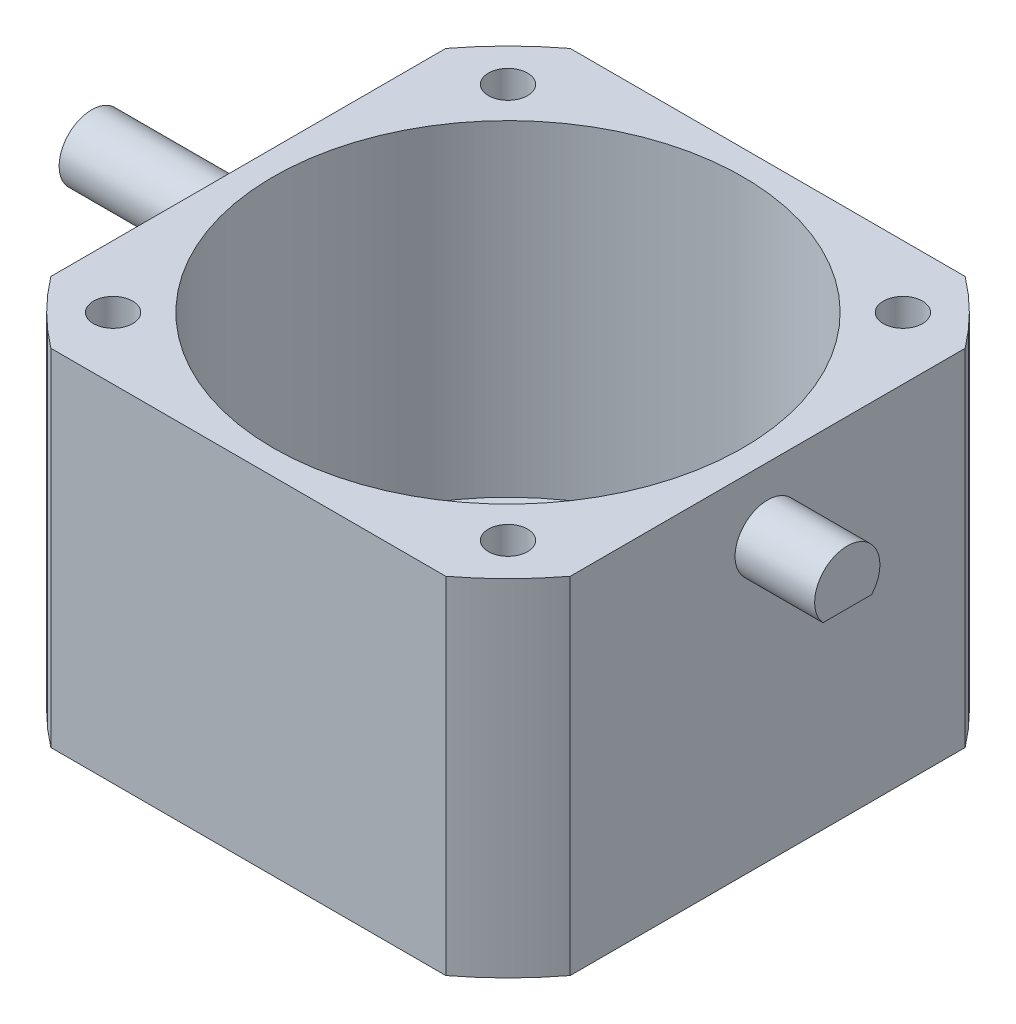
ISO-10303-21;
HEADER;
FILE_DESCRIPTION(('STEP AP214'),'2;1');
FILE_NAME('part.step','',(''),(''),'','','');
FILE_SCHEMA(('AUTOMOTIVE_DESIGN { 1 0 10303 214 1 1 1 1 }'));
ENDSEC;
DATA;
#1=APPLICATION_CONTEXT('core data for automotive mechanical design processes');
#2=APPLICATION_PROTOCOL_DEFINITION('international standard','automotive_design',2000,#1);
#3=PRODUCT_CONTEXT('',#1,'mechanical');
#4=PRODUCT('Part','Part','',(#3));
#5=PRODUCT_RELATED_PRODUCT_CATEGORY('part','',(#4));
#6=PRODUCT_DEFINITION_FORMATION('','',#4);
#7=PRODUCT_DEFINITION_CONTEXT('part definition',#1,'design');
#8=PRODUCT_DEFINITION('design','',#6,#7);
#9=PRODUCT_DEFINITION_SHAPE('','',#8);
#10=(LENGTH_UNIT() NAMED_UNIT(*) SI_UNIT(.MILLI.,.METRE.));
#11=(NAMED_UNIT(*) PLANE_ANGLE_UNIT() SI_UNIT($,.RADIAN.));
#12=(NAMED_UNIT(*) SI_UNIT($,.STERADIAN.) SOLID_ANGLE_UNIT());
#13=UNCERTAINTY_MEASURE_WITH_UNIT(LENGTH_MEASURE(1.E-05),#10,'distance_accuracy_value','');
#14=(GEOMETRIC_REPRESENTATION_CONTEXT(3) GLOBAL_UNCERTAINTY_ASSIGNED_CONTEXT((#13)) GLOBAL_UNIT_ASSIGNED_CONTEXT((#10,
#11,#12)) REPRESENTATION_CONTEXT('',''));
#15=CARTESIAN_POINT('',(0.,0.,0.));
#16=DIRECTION('',(0.,0.,1.));
#17=DIRECTION('',(1.,0.,0.));
#18=AXIS2_PLACEMENT_3D('',#15,#16,#17);
#19=CARTESIAN_POINT('',(0.,40.,0.));
#20=DIRECTION('',(0.,0.,-1.));
#21=DIRECTION('',(-1.,0.,0.));
#22=AXIS2_PLACEMENT_3D('',#19,#20,#21);
#23=PLANE('',#22);
#24=DIRECTION('',(-1.,0.,0.));
#25=VECTOR('',#24,1.);
#26=CARTESIAN_POINT('',(0.,13.5,0.));
#27=LINE('',#26,#25);
#28=CARTESIAN_POINT('',(35.0324155375142,13.5,0.));
#29=VERTEX_POINT('',#28);
#30=CARTESIAN_POINT('',(4.76758446248583,13.5,0.));
#31=VERTEX_POINT('',#30);
#32=EDGE_CURVE('E278',#29,#31,#27,.T.);
#33=ORIENTED_EDGE('',*,*,#32,.F.);
#34=DIRECTION('',(0.,1.,0.));
#35=VECTOR('',#34,1.);
#36=CARTESIAN_POINT('',(35.0324155375142,0.,0.));
#37=LINE('',#36,#35);
#38=CARTESIAN_POINT('',(35.0324155375142,40.,0.));
#39=VERTEX_POINT('',#38);
#40=EDGE_CURVE('E211',#29,#39,#37,.T.);
#41=ORIENTED_EDGE('',*,*,#40,.T.);
#42=DIRECTION('',(1.,0.,0.));
#43=VECTOR('',#42,1.);
#44=CARTESIAN_POINT('',(0.,40.,0.));
#45=LINE('',#44,#43);
#46=CARTESIAN_POINT('',(4.76758446248583,40.,0.));
#47=VERTEX_POINT('',#46);
#48=EDGE_CURVE('E234',#47,#39,#45,.T.);
#49=ORIENTED_EDGE('',*,*,#48,.F.);
#50=DIRECTION('',(0.,1.,0.));
#51=VECTOR('',#50,1.);
#52=CARTESIAN_POINT('',(4.76758446248583,0.,0.));
#53=LINE('',#52,#51);
#54=EDGE_CURVE('E198',#31,#47,#53,.T.);
#55=ORIENTED_EDGE('',*,*,#54,.F.);
#56=EDGE_LOOP('',(#33,#41,#49,#55));
#57=FACE_BOUND('',#56,.T.);
#58=ADVANCED_FACE('F96',(#57),#23,.F.);
#59=CARTESIAN_POINT('',(0.,40.,-39.8));
#60=DIRECTION('',(0.,0.,1.));
#61=DIRECTION('',(1.,0.,0.));
#62=AXIS2_PLACEMENT_3D('',#59,#60,#61);
#63=PLANE('',#62);
#64=DIRECTION('',(1.,0.,0.));
#65=VECTOR('',#64,1.);
#66=CARTESIAN_POINT('',(0.,13.5,-39.8));
#67=LINE('',#66,#65);
#68=CARTESIAN_POINT('',(4.76758446248581,13.5,-39.8));
#69=VERTEX_POINT('',#68);
#70=CARTESIAN_POINT('',(35.0324155375142,13.5,-39.8));
#71=VERTEX_POINT('',#70);
#72=EDGE_CURVE('E174',#69,#71,#67,.T.);
#73=ORIENTED_EDGE('',*,*,#72,.F.);
#74=DIRECTION('',(0.,1.,0.));
#75=VECTOR('',#74,1.);
#76=CARTESIAN_POINT('',(4.76758446248582,0.,-39.8));
#77=LINE('',#76,#75);
#78=CARTESIAN_POINT('',(4.76758446248582,40.,-39.8));
#79=VERTEX_POINT('',#78);
#80=EDGE_CURVE('E185',#69,#79,#77,.T.);
#81=ORIENTED_EDGE('',*,*,#80,.T.);
#82=DIRECTION('',(-1.,0.,0.));
#83=VECTOR('',#82,1.);
#84=CARTESIAN_POINT('',(0.,40.,-39.8));
#85=LINE('',#84,#83);
#86=CARTESIAN_POINT('',(35.0324155375142,40.,-39.8));
#87=VERTEX_POINT('',#86);
#88=EDGE_CURVE('E240',#87,#79,#85,.T.);
#89=ORIENTED_EDGE('',*,*,#88,.F.);
#90=DIRECTION('',(0.,1.,0.));
#91=VECTOR('',#90,1.);
#92=CARTESIAN_POINT('',(35.0324155375142,0.,-39.8));
#93=LINE('',#92,#91);
#94=EDGE_CURVE('E187',#71,#87,#93,.T.);
#95=ORIENTED_EDGE('',*,*,#94,.F.);
#96=EDGE_LOOP('',(#73,#81,#89,#95));
#97=FACE_BOUND('',#96,.T.);
#98=ADVANCED_FACE('F183',(#97),#63,.F.);
#99=CARTESIAN_POINT('',(39.8,40.,0.));
#100=DIRECTION('',(-1.,0.,0.));
#101=DIRECTION('',(0.,0.,1.));
#102=AXIS2_PLACEMENT_3D('',#99,#100,#101);
#103=PLANE('',#102);
#104=CARTESIAN_POINT('',(39.8,35.,-19.9));
#105=DIRECTION('',(-1.,0.,0.));
#106=DIRECTION('',(0.,0.,1.));
#107=AXIS2_PLACEMENT_3D('',#104,#105,#106);
#108=CIRCLE('',#107,2.5);
#109=CARTESIAN_POINT('',(39.8,35.,-17.4));
#110=VERTEX_POINT('',#109);
#111=EDGE_CURVE('E13',#110,#110,#108,.F.);
#112=ORIENTED_EDGE('',*,*,#111,.F.);
#113=EDGE_LOOP('',(#112));
#114=FACE_BOUND('',#113,.T.);
#115=DIRECTION('',(0.,0.,1.));
#116=VECTOR('',#115,1.);
#117=CARTESIAN_POINT('',(39.8,13.5,0.));
#118=LINE('',#117,#116);
#119=CARTESIAN_POINT('',(39.8,13.5,-35.0324155375142));
#120=VERTEX_POINT('',#119);
#121=CARTESIAN_POINT('',(39.8,13.5,-4.76758446248582));
#122=VERTEX_POINT('',#121);
#123=EDGE_CURVE('E272',#120,#122,#118,.T.);
#124=ORIENTED_EDGE('',*,*,#123,.F.);
#125=DIRECTION('',(0.,1.,0.));
#126=VECTOR('',#125,1.);
#127=CARTESIAN_POINT('',(39.8,0.,-35.0324155375142));
#128=LINE('',#127,#126);
#129=CARTESIAN_POINT('',(39.8,40.,-35.0324155375142));
#130=VERTEX_POINT('',#129);
#131=EDGE_CURVE('E217',#120,#130,#128,.T.);
#132=ORIENTED_EDGE('',*,*,#131,.T.);
#133=DIRECTION('',(0.,0.,-1.));
#134=VECTOR('',#133,1.);
#135=CARTESIAN_POINT('',(39.8,40.,0.));
#136=LINE('',#135,#134);
#137=CARTESIAN_POINT('',(39.8,40.,-4.76758446248582));
#138=VERTEX_POINT('',#137);
#139=EDGE_CURVE('E237',#138,#130,#136,.T.);
#140=ORIENTED_EDGE('',*,*,#139,.F.);
#141=DIRECTION('',(0.,1.,0.));
#142=VECTOR('',#141,1.);
#143=CARTESIAN_POINT('',(39.8,0.,-4.76758446248582));
#144=LINE('',#143,#142);
#145=EDGE_CURVE('E205',#122,#138,#144,.T.);
#146=ORIENTED_EDGE('',*,*,#145,.F.);
#147=EDGE_LOOP('',(#124,#132,#140,#146));
#148=FACE_BOUND('',#147,.T.);
#149=ADVANCED_FACE('F253',(#114,#148),#103,.F.);
#150=CARTESIAN_POINT('',(0.,40.,0.));
#151=DIRECTION('',(1.,0.,0.));
#152=DIRECTION('',(0.,0.,-1.));
#153=AXIS2_PLACEMENT_3D('',#150,#151,#152);
#154=PLANE('',#153);
#155=CARTESIAN_POINT('',(0.,35.,-19.9));
#156=DIRECTION('',(1.,0.,0.));
#157=DIRECTION('',(0.,0.,-1.));
#158=AXIS2_PLACEMENT_3D('',#155,#156,#157);
#159=CIRCLE('',#158,2.5);
#160=CARTESIAN_POINT('',(0.,35.,-22.4));
#161=VERTEX_POINT('',#160);
#162=EDGE_CURVE('E104',#161,#161,#159,.F.);
#163=ORIENTED_EDGE('',*,*,#162,.F.);
#164=EDGE_LOOP('',(#163));
#165=FACE_BOUND('',#164,.T.);
#166=DIRECTION('',(0.,0.,-1.));
#167=VECTOR('',#166,1.);
#168=CARTESIAN_POINT('',(0.,13.5,0.));
#169=LINE('',#168,#167);
#170=CARTESIAN_POINT('',(0.,13.5,-4.76758446248581));
#171=VERTEX_POINT('',#170);
#172=CARTESIAN_POINT('',(0.,13.5,-35.0324155375142));
#173=VERTEX_POINT('',#172);
#174=EDGE_CURVE('E111',#171,#173,#169,.T.);
#175=ORIENTED_EDGE('',*,*,#174,.F.);
#176=DIRECTION('',(0.,1.,0.));
#177=VECTOR('',#176,1.);
#178=CARTESIAN_POINT('',(0.,0.,-4.76758446248583));
#179=LINE('',#178,#177);
#180=CARTESIAN_POINT('',(0.,40.,-4.76758446248583));
#181=VERTEX_POINT('',#180);
#182=EDGE_CURVE('E204',#171,#181,#179,.T.);
#183=ORIENTED_EDGE('',*,*,#182,.T.);
#184=DIRECTION('',(0.,0.,1.));
#185=VECTOR('',#184,1.);
#186=CARTESIAN_POINT('',(0.,40.,0.));
#187=LINE('',#186,#185);
#188=CARTESIAN_POINT('',(0.,40.,-35.0324155375142));
#189=VERTEX_POINT('',#188);
#190=EDGE_CURVE('E227',#189,#181,#187,.T.);
#191=ORIENTED_EDGE('',*,*,#190,.F.);
#192=DIRECTION('',(0.,1.,0.));
#193=VECTOR('',#192,1.);
#194=CARTESIAN_POINT('',(0.,0.,-35.0324155375142));
#195=LINE('',#194,#193);
#196=EDGE_CURVE('E194',#173,#189,#195,.T.);
#197=ORIENTED_EDGE('',*,*,#196,.F.);
#198=EDGE_LOOP('',(#175,#183,#191,#197));
#199=FACE_BOUND('',#198,.T.);
#200=ADVANCED_FACE('F98',(#165,#199),#154,.F.);
#201=CARTESIAN_POINT('',(19.9,0.,-19.9));
#202=DIRECTION('',(0.,1.,0.));
#203=DIRECTION('',(0.,0.,1.));
#204=AXIS2_PLACEMENT_3D('',#201,#202,#203);
#205=CYLINDRICAL_SURFACE('',#204,25.);
#206=ORIENTED_EDGE('',*,*,#131,.F.);
#207=CARTESIAN_POINT('',(19.9,13.5,-19.9));
#208=DIRECTION('',(0.,-1.,0.));
#209=DIRECTION('',(0.,0.,-1.));
#210=AXIS2_PLACEMENT_3D('',#207,#208,#209);
#211=CIRCLE('',#210,25.);
#212=EDGE_CURVE('E188',#71,#120,#211,.T.);
#213=ORIENTED_EDGE('',*,*,#212,.F.);
#214=ORIENTED_EDGE('',*,*,#94,.T.);
#215=CARTESIAN_POINT('',(19.9,40.,-19.9));
#216=DIRECTION('',(0.,1.,0.));
#217=DIRECTION('',(0.,0.,1.));
#218=AXIS2_PLACEMENT_3D('',#215,#216,#217);
#219=CIRCLE('',#218,25.);
#220=EDGE_CURVE('E196',#130,#87,#219,.T.);
#221=ORIENTED_EDGE('',*,*,#220,.F.);
#222=EDGE_LOOP('',(#206,#213,#214,#221));
#223=FACE_BOUND('',#222,.T.);
#224=ADVANCED_FACE('F252',(#223),#205,.T.);
#225=CARTESIAN_POINT('',(19.9,0.,-19.9));
#226=DIRECTION('',(0.,1.,0.));
#227=DIRECTION('',(0.,0.,1.));
#228=AXIS2_PLACEMENT_3D('',#225,#226,#227);
#229=CYLINDRICAL_SURFACE('',#228,25.);
#230=ORIENTED_EDGE('',*,*,#40,.F.);
#231=CARTESIAN_POINT('',(19.9,13.5,-19.9));
#232=DIRECTION('',(0.,-1.,0.));
#233=DIRECTION('',(0.,0.,-1.));
#234=AXIS2_PLACEMENT_3D('',#231,#232,#233);
#235=CIRCLE('',#234,25.);
#236=EDGE_CURVE('E274',#122,#29,#235,.T.);
#237=ORIENTED_EDGE('',*,*,#236,.F.);
#238=ORIENTED_EDGE('',*,*,#145,.T.);
#239=CARTESIAN_POINT('',(19.9,40.,-19.9));
#240=DIRECTION('',(0.,1.,0.));
#241=DIRECTION('',(0.,0.,1.));
#242=AXIS2_PLACEMENT_3D('',#239,#240,#241);
#243=CIRCLE('',#242,25.);
#244=EDGE_CURVE('E208',#39,#138,#243,.T.);
#245=ORIENTED_EDGE('',*,*,#244,.F.);
#246=EDGE_LOOP('',(#230,#237,#238,#245));
#247=FACE_BOUND('',#246,.T.);
#248=ADVANCED_FACE('F368',(#247),#229,.T.);
#249=CARTESIAN_POINT('',(19.9,0.,-19.9));
#250=DIRECTION('',(0.,1.,0.));
#251=DIRECTION('',(0.,0.,1.));
#252=AXIS2_PLACEMENT_3D('',#249,#250,#251);
#253=CYLINDRICAL_SURFACE('',#252,25.);
#254=ORIENTED_EDGE('',*,*,#182,.F.);
#255=CARTESIAN_POINT('',(19.9,13.5,-19.9));
#256=DIRECTION('',(0.,-1.,0.));
#257=DIRECTION('',(0.,0.,-1.));
#258=AXIS2_PLACEMENT_3D('',#255,#256,#257);
#259=CIRCLE('',#258,25.);
#260=EDGE_CURVE('E258',#31,#171,#259,.T.);
#261=ORIENTED_EDGE('',*,*,#260,.F.);
#262=ORIENTED_EDGE('',*,*,#54,.T.);
#263=CARTESIAN_POINT('',(19.9,40.,-19.9));
#264=DIRECTION('',(0.,1.,0.));
#265=DIRECTION('',(0.,0.,1.));
#266=AXIS2_PLACEMENT_3D('',#263,#264,#265);
#267=CIRCLE('',#266,25.);
#268=EDGE_CURVE('E201',#181,#47,#267,.T.);
#269=ORIENTED_EDGE('',*,*,#268,.F.);
#270=EDGE_LOOP('',(#254,#261,#262,#269));
#271=FACE_BOUND('',#270,.T.);
#272=ADVANCED_FACE('F262',(#271),#253,.T.);
#273=CARTESIAN_POINT('',(19.9,0.,-19.9));
#274=DIRECTION('',(0.,1.,0.));
#275=DIRECTION('',(0.,0.,1.));
#276=AXIS2_PLACEMENT_3D('',#273,#274,#275);
#277=CYLINDRICAL_SURFACE('',#276,25.);
#278=ORIENTED_EDGE('',*,*,#80,.F.);
#279=CARTESIAN_POINT('',(19.9,13.5,-19.9));
#280=DIRECTION('',(0.,-1.,0.));
#281=DIRECTION('',(0.,0.,-1.));
#282=AXIS2_PLACEMENT_3D('',#279,#280,#281);
#283=CIRCLE('',#282,25.);
#284=EDGE_CURVE('E170',#173,#69,#283,.T.);
#285=ORIENTED_EDGE('',*,*,#284,.F.);
#286=ORIENTED_EDGE('',*,*,#196,.T.);
#287=CARTESIAN_POINT('',(19.9,40.,-19.9));
#288=DIRECTION('',(0.,1.,0.));
#289=DIRECTION('',(0.,0.,1.));
#290=AXIS2_PLACEMENT_3D('',#287,#288,#289);
#291=CIRCLE('',#290,25.);
#292=EDGE_CURVE('E192',#79,#189,#291,.T.);
#293=ORIENTED_EDGE('',*,*,#292,.F.);
#294=EDGE_LOOP('',(#278,#285,#286,#293));
#295=FACE_BOUND('',#294,.T.);
#296=ADVANCED_FACE('F190',(#295),#277,.T.);
#297=CARTESIAN_POINT('',(35.0324155375142,0.,-4.76758446248582));
#298=DIRECTION('',(0.,1.,0.));
#299=DIRECTION('',(0.,0.,1.));
#300=AXIS2_PLACEMENT_3D('',#297,#298,#299);
#301=CYLINDRICAL_SURFACE('',#300,1.5);
#302=CARTESIAN_POINT('',(35.0324155375142,40.,-4.76758446248582));
#303=DIRECTION('',(0.,1.,0.));
#304=DIRECTION('',(0.,0.,1.));
#305=AXIS2_PLACEMENT_3D('',#302,#303,#304);
#306=CIRCLE('',#305,1.5);
#307=CARTESIAN_POINT('',(35.0324155375142,40.,-3.26758446248582));
#308=VERTEX_POINT('',#307);
#309=EDGE_CURVE('E212',#308,#308,#306,.T.);
#310=ORIENTED_EDGE('',*,*,#309,.T.);
#311=EDGE_LOOP('',(#310));
#312=FACE_BOUND('',#311,.T.);
#313=CARTESIAN_POINT('',(35.0324155375142,13.5,-4.76758446248582));
#314=DIRECTION('',(0.,-1.,0.));
#315=DIRECTION('',(0.,0.,-1.));
#316=AXIS2_PLACEMENT_3D('',#313,#314,#315);
#317=CIRCLE('',#316,1.5);
#318=CARTESIAN_POINT('',(35.0324155375142,13.5,-6.26758446248583));
#319=VERTEX_POINT('',#318);
#320=EDGE_CURVE('E257',#319,#319,#317,.F.);
#321=ORIENTED_EDGE('',*,*,#320,.F.);
#322=EDGE_LOOP('',(#321));
#323=FACE_BOUND('',#322,.T.);
#324=ADVANCED_FACE('F328',(#312,#323),#301,.F.);
#325=CARTESIAN_POINT('',(35.0324155375142,0.,-35.0324155375142));
#326=DIRECTION('',(0.,1.,0.));
#327=DIRECTION('',(0.,0.,1.));
#328=AXIS2_PLACEMENT_3D('',#325,#326,#327);
#329=CYLINDRICAL_SURFACE('',#328,1.5);
#330=CARTESIAN_POINT('',(35.0324155375142,40.,-35.0324155375142));
#331=DIRECTION('',(0.,1.,0.));
#332=DIRECTION('',(0.,0.,1.));
#333=AXIS2_PLACEMENT_3D('',#330,#331,#332);
#334=CIRCLE('',#333,1.5);
#335=CARTESIAN_POINT('',(35.0324155375142,40.,-33.5324155375142));
#336=VERTEX_POINT('',#335);
#337=EDGE_CURVE('E316',#336,#336,#334,.T.);
#338=ORIENTED_EDGE('',*,*,#337,.T.);
#339=EDGE_LOOP('',(#338));
#340=FACE_BOUND('',#339,.T.);
#341=CARTESIAN_POINT('',(35.0324155375142,13.5,-35.0324155375142));
#342=DIRECTION('',(0.,-1.,0.));
#343=DIRECTION('',(0.,0.,-1.));
#344=AXIS2_PLACEMENT_3D('',#341,#342,#343);
#345=CIRCLE('',#344,1.5);
#346=CARTESIAN_POINT('',(35.0324155375142,13.5,-36.5324155375142));
#347=VERTEX_POINT('',#346);
#348=EDGE_CURVE('E701',#347,#347,#345,.F.);
#349=ORIENTED_EDGE('',*,*,#348,.F.);
#350=EDGE_LOOP('',(#349));
#351=FACE_BOUND('',#350,.T.);
#352=ADVANCED_FACE('F450',(#340,#351),#329,.F.);
#353=CARTESIAN_POINT('',(4.76758446248582,0.,-35.0324155375142));
#354=DIRECTION('',(0.,1.,0.));
#355=DIRECTION('',(0.,0.,1.));
#356=AXIS2_PLACEMENT_3D('',#353,#354,#355);
#357=CYLINDRICAL_SURFACE('',#356,1.5);
#358=CARTESIAN_POINT('',(4.76758446248582,40.,-35.0324155375142));
#359=DIRECTION('',(0.,1.,0.));
#360=DIRECTION('',(0.,0.,1.));
#361=AXIS2_PLACEMENT_3D('',#358,#359,#360);
#362=CIRCLE('',#361,1.5);
#363=CARTESIAN_POINT('',(4.76758446248582,40.,-33.5324155375142));
#364=VERTEX_POINT('',#363);
#365=EDGE_CURVE('E320',#364,#364,#362,.T.);
#366=ORIENTED_EDGE('',*,*,#365,.T.);
#367=EDGE_LOOP('',(#366));
#368=FACE_BOUND('',#367,.T.);
#369=CARTESIAN_POINT('',(4.76758446248582,13.5,-35.0324155375142));
#370=DIRECTION('',(0.,-1.,0.));
#371=DIRECTION('',(0.,0.,-1.));
#372=AXIS2_PLACEMENT_3D('',#369,#370,#371);
#373=CIRCLE('',#372,1.5);
#374=CARTESIAN_POINT('',(4.76758446248582,13.5,-36.5324155375142));
#375=VERTEX_POINT('',#374);
#376=EDGE_CURVE('E179',#375,#375,#373,.F.);
#377=ORIENTED_EDGE('',*,*,#376,.F.);
#378=EDGE_LOOP('',(#377));
#379=FACE_BOUND('',#378,.T.);
#380=ADVANCED_FACE('F446',(#368,#379),#357,.F.);
#381=CARTESIAN_POINT('',(4.76758446248583,0.,-4.76758446248583));
#382=DIRECTION('',(0.,1.,0.));
#383=DIRECTION('',(0.,0.,1.));
#384=AXIS2_PLACEMENT_3D('',#381,#382,#383);
#385=CYLINDRICAL_SURFACE('',#384,1.5);
#386=CARTESIAN_POINT('',(4.76758446248583,40.,-4.76758446248583));
#387=DIRECTION('',(0.,1.,0.));
#388=DIRECTION('',(0.,0.,1.));
#389=AXIS2_PLACEMENT_3D('',#386,#387,#388);
#390=CIRCLE('',#389,1.5);
#391=CARTESIAN_POINT('',(4.76758446248583,40.,-3.26758446248583));
#392=VERTEX_POINT('',#391);
#393=EDGE_CURVE('E317',#392,#392,#390,.T.);
#394=ORIENTED_EDGE('',*,*,#393,.T.);
#395=EDGE_LOOP('',(#394));
#396=FACE_BOUND('',#395,.T.);
#397=CARTESIAN_POINT('',(4.76758446248583,13.5,-4.76758446248583));
#398=DIRECTION('',(0.,-1.,0.));
#399=DIRECTION('',(0.,0.,-1.));
#400=AXIS2_PLACEMENT_3D('',#397,#398,#399);
#401=CIRCLE('',#400,1.5);
#402=CARTESIAN_POINT('',(4.76758446248583,13.5,-6.26758446248583));
#403=VERTEX_POINT('',#402);
#404=EDGE_CURVE('E283',#403,#403,#401,.F.);
#405=ORIENTED_EDGE('',*,*,#404,.F.);
#406=EDGE_LOOP('',(#405));
#407=FACE_BOUND('',#406,.T.);
#408=ADVANCED_FACE('F412',(#396,#407),#385,.F.);
#409=CARTESIAN_POINT('',(19.9,12.,-32.4));
#410=DIRECTION('',(0.,-1.,0.));
#411=DIRECTION('',(0.,0.,-1.));
#412=AXIS2_PLACEMENT_3D('',#409,#410,#411);
#413=PLANE('',#412);
#414=CARTESIAN_POINT('',(19.9,12.,-7.40000000000001));
#415=DIRECTION('',(0.,-1.,0.));
#416=DIRECTION('',(0.,0.,-1.));
#417=AXIS2_PLACEMENT_3D('',#414,#415,#416);
#418=CIRCLE('',#417,1.5);
#419=CARTESIAN_POINT('',(19.9,12.,-8.90000000000001));
#420=VERTEX_POINT('',#419);
#421=EDGE_CURVE('E307',#420,#420,#418,.F.);
#422=ORIENTED_EDGE('',*,*,#421,.T.);
#423=EDGE_LOOP('',(#422));
#424=FACE_BOUND('',#423,.T.);
#425=CARTESIAN_POINT('',(19.9,12.,-19.9));
#426=DIRECTION('',(0.,-1.,0.));
#427=DIRECTION('',(0.,0.,-1.));
#428=AXIS2_PLACEMENT_3D('',#425,#426,#427);
#429=CIRCLE('',#428,6.99999999999998);
#430=CARTESIAN_POINT('',(19.9,12.,-26.9));
#431=VERTEX_POINT('',#430);
#432=EDGE_CURVE('E299',#431,#431,#429,.T.);
#433=ORIENTED_EDGE('',*,*,#432,.F.);
#434=EDGE_LOOP('',(#433));
#435=FACE_BOUND('',#434,.T.);
#436=CARTESIAN_POINT('',(19.9,12.,-32.4));
#437=DIRECTION('',(0.,-1.,0.));
#438=DIRECTION('',(0.,0.,-1.));
#439=AXIS2_PLACEMENT_3D('',#436,#437,#438);
#440=CIRCLE('',#439,1.5);
#441=CARTESIAN_POINT('',(19.9,12.,-33.9));
#442=VERTEX_POINT('',#441);
#443=EDGE_CURVE('E310',#442,#442,#440,.F.);
#444=ORIENTED_EDGE('',*,*,#443,.T.);
#445=EDGE_LOOP('',(#444));
#446=FACE_BOUND('',#445,.T.);
#447=CARTESIAN_POINT('',(19.9,12.,-19.9));
#448=DIRECTION('',(0.,-1.,0.));
#449=DIRECTION('',(0.,0.,-1.));
#450=AXIS2_PLACEMENT_3D('',#447,#448,#449);
#451=CIRCLE('',#450,17.);
#452=CARTESIAN_POINT('',(19.9,12.,-36.9));
#453=VERTEX_POINT('',#452);
#454=EDGE_CURVE('E287',#453,#453,#451,.T.);
#455=ORIENTED_EDGE('',*,*,#454,.T.);
#456=EDGE_LOOP('',(#455));
#457=FACE_BOUND('',#456,.T.);
#458=ADVANCED_FACE('F384',(#424,#435,#446,#457),#413,.T.);
#459=CARTESIAN_POINT('',(44.9,35.,-19.9));
#460=DIRECTION('',(-1.,0.,0.));
#461=DIRECTION('',(0.,0.,1.));
#462=AXIS2_PLACEMENT_3D('',#459,#460,#461);
#463=CYLINDRICAL_SURFACE('',#462,2.5);
#464=ORIENTED_EDGE('',*,*,#111,.T.);
#465=EDGE_LOOP('',(#464));
#466=FACE_BOUND('',#465,.T.);
#467=DIRECTION('',(1.,0.,0.));
#468=VECTOR('',#467,1.);
#469=CARTESIAN_POINT('',(42.9,33.3333333333333,-18.0366100187502));
#470=LINE('',#469,#468);
#471=CARTESIAN_POINT('',(42.9,33.3333333333333,-18.0366100187502));
#472=VERTEX_POINT('',#471);
#473=CARTESIAN_POINT('',(45.9,33.3333333333333,-18.0366100187502));
#474=VERTEX_POINT('',#473);
#475=EDGE_CURVE('E296',#472,#474,#470,.T.);
#476=ORIENTED_EDGE('',*,*,#475,.T.);
#477=CARTESIAN_POINT('',(45.9,35.,-19.9));
#478=DIRECTION('',(1.,0.,0.));
#479=DIRECTION('',(0.,0.,-1.));
#480=AXIS2_PLACEMENT_3D('',#477,#478,#479);
#481=CIRCLE('',#480,2.5);
#482=CARTESIAN_POINT('',(45.9,33.3333333333333,-21.7633899812498));
#483=VERTEX_POINT('',#482);
#484=EDGE_CURVE('E313',#483,#474,#481,.T.);
#485=ORIENTED_EDGE('',*,*,#484,.F.);
#486=DIRECTION('',(1.,0.,0.));
#487=VECTOR('',#486,1.);
#488=CARTESIAN_POINT('',(42.9,33.3333333333333,-21.7633899812498));
#489=LINE('',#488,#487);
#490=CARTESIAN_POINT('',(42.9,33.3333333333333,-21.7633899812498));
#491=VERTEX_POINT('',#490);
#492=EDGE_CURVE('E119',#491,#483,#489,.T.);
#493=ORIENTED_EDGE('',*,*,#492,.F.);
#494=CARTESIAN_POINT('',(42.9,35.,-19.9));
#495=DIRECTION('',(1.,0.,0.));
#496=DIRECTION('',(0.,0.,-1.));
#497=AXIS2_PLACEMENT_3D('',#494,#495,#496);
#498=CIRCLE('',#497,2.5);
#499=EDGE_CURVE('E293',#472,#491,#498,.T.);
#500=ORIENTED_EDGE('',*,*,#499,.F.);
#501=EDGE_LOOP('',(#476,#485,#493,#500));
#502=FACE_BOUND('',#501,.T.);
#503=ADVANCED_FACE('F380',(#466,#502),#463,.T.);
#504=CARTESIAN_POINT('',(45.9,35.,-19.9));
#505=DIRECTION('',(1.,0.,0.));
#506=DIRECTION('',(0.,0.,-1.));
#507=AXIS2_PLACEMENT_3D('',#504,#505,#506);
#508=PLANE('',#507);
#509=ORIENTED_EDGE('',*,*,#484,.T.);
#510=DIRECTION('',(0.,0.,-1.));
#511=VECTOR('',#510,1.);
#512=CARTESIAN_POINT('',(45.9,33.3333333333333,0.));
#513=LINE('',#512,#511);
#514=EDGE_CURVE('E286',#474,#483,#513,.T.);
#515=ORIENTED_EDGE('',*,*,#514,.T.);
#516=EDGE_LOOP('',(#509,#515));
#517=FACE_BOUND('',#516,.T.);
#518=ADVANCED_FACE('F383',(#517),#508,.T.);
#519=CARTESIAN_POINT('',(19.9,0.,-7.40000000000001));
#520=DIRECTION('',(0.,1.,0.));
#521=DIRECTION('',(0.,0.,1.));
#522=AXIS2_PLACEMENT_3D('',#519,#520,#521);
#523=CYLINDRICAL_SURFACE('',#522,1.5);
#524=CARTESIAN_POINT('',(19.9,15.,-7.40000000000001));
#525=DIRECTION('',(0.,1.,0.));
#526=DIRECTION('',(0.,0.,1.));
#527=AXIS2_PLACEMENT_3D('',#524,#525,#526);
#528=CIRCLE('',#527,1.5);
#529=CARTESIAN_POINT('',(19.9,15.,-5.9));
#530=VERTEX_POINT('',#529);
#531=EDGE_CURVE('E223',#530,#530,#528,.T.);
#532=ORIENTED_EDGE('',*,*,#531,.T.);
#533=EDGE_LOOP('',(#532));
#534=FACE_BOUND('',#533,.T.);
#535=ORIENTED_EDGE('',*,*,#421,.F.);
#536=EDGE_LOOP('',(#535));
#537=FACE_BOUND('',#536,.T.);
#538=ADVANCED_FACE('F393',(#534,#537),#523,.F.);
#539=CARTESIAN_POINT('',(19.9,0.,-32.4));
#540=DIRECTION('',(0.,1.,0.));
#541=DIRECTION('',(0.,0.,1.));
#542=AXIS2_PLACEMENT_3D('',#539,#540,#541);
#543=CYLINDRICAL_SURFACE('',#542,1.5);
#544=CARTESIAN_POINT('',(19.9,15.,-32.4));
#545=DIRECTION('',(0.,1.,0.));
#546=DIRECTION('',(0.,0.,1.));
#547=AXIS2_PLACEMENT_3D('',#544,#545,#546);
#548=CIRCLE('',#547,1.5);
#549=CARTESIAN_POINT('',(19.9,15.,-30.9));
#550=VERTEX_POINT('',#549);
#551=EDGE_CURVE('E231',#550,#550,#548,.T.);
#552=ORIENTED_EDGE('',*,*,#551,.T.);
#553=EDGE_LOOP('',(#552));
#554=FACE_BOUND('',#553,.T.);
#555=ORIENTED_EDGE('',*,*,#443,.F.);
#556=EDGE_LOOP('',(#555));
#557=FACE_BOUND('',#556,.T.);
#558=ADVANCED_FACE('F390',(#554,#557),#543,.F.);
#559=CARTESIAN_POINT('',(0.,15.,0.));
#560=DIRECTION('',(0.,1.,0.));
#561=DIRECTION('',(0.,0.,1.));
#562=AXIS2_PLACEMENT_3D('',#559,#560,#561);
#563=PLANE('',#562);
#564=CARTESIAN_POINT('',(19.9,15.,-19.9));
#565=DIRECTION('',(0.,1.,0.));
#566=DIRECTION('',(0.,0.,1.));
#567=AXIS2_PLACEMENT_3D('',#564,#565,#566);
#568=CIRCLE('',#567,18.);
#569=CARTESIAN_POINT('',(19.9,15.,-1.9));
#570=VERTEX_POINT('',#569);
#571=EDGE_CURVE('E224',#570,#570,#568,.T.);
#572=ORIENTED_EDGE('',*,*,#571,.T.);
#573=EDGE_LOOP('',(#572));
#574=FACE_BOUND('',#573,.T.);
#575=ORIENTED_EDGE('',*,*,#551,.F.);
#576=EDGE_LOOP('',(#575));
#577=FACE_BOUND('',#576,.T.);
#578=CARTESIAN_POINT('',(19.9,15.,-19.9));
#579=DIRECTION('',(0.,1.,0.));
#580=DIRECTION('',(0.,0.,1.));
#581=AXIS2_PLACEMENT_3D('',#578,#579,#580);
#582=CIRCLE('',#581,6.99999999999998);
#583=CARTESIAN_POINT('',(19.9,15.,-26.9));
#584=VERTEX_POINT('',#583);
#585=EDGE_CURVE('E304',#584,#584,#582,.F.);
#586=ORIENTED_EDGE('',*,*,#585,.T.);
#587=EDGE_LOOP('',(#586));
#588=FACE_BOUND('',#587,.T.);
#589=ORIENTED_EDGE('',*,*,#531,.F.);
#590=EDGE_LOOP('',(#589));
#591=FACE_BOUND('',#590,.T.);
#592=ADVANCED_FACE('F334',(#574,#577,#588,#591),#563,.T.);
#593=CARTESIAN_POINT('',(0.,40.,0.));
#594=DIRECTION('',(0.,-1.,0.));
#595=DIRECTION('',(0.,0.,-1.));
#596=AXIS2_PLACEMENT_3D('',#593,#594,#595);
#597=PLANE('',#596);
#598=ORIENTED_EDGE('',*,*,#393,.F.);
#599=EDGE_LOOP('',(#598));
#600=FACE_BOUND('',#599,.T.);
#601=ORIENTED_EDGE('',*,*,#365,.F.);
#602=EDGE_LOOP('',(#601));
#603=FACE_BOUND('',#602,.T.);
#604=ORIENTED_EDGE('',*,*,#337,.F.);
#605=EDGE_LOOP('',(#604));
#606=FACE_BOUND('',#605,.T.);
#607=ORIENTED_EDGE('',*,*,#309,.F.);
#608=EDGE_LOOP('',(#607));
#609=FACE_BOUND('',#608,.T.);
#610=CARTESIAN_POINT('',(19.9,40.,-19.9));
#611=DIRECTION('',(0.,1.,0.));
#612=DIRECTION('',(0.,0.,1.));
#613=AXIS2_PLACEMENT_3D('',#610,#611,#612);
#614=CIRCLE('',#613,18.);
#615=CARTESIAN_POINT('',(19.9,40.,-1.9));
#616=VERTEX_POINT('',#615);
#617=EDGE_CURVE('E228',#616,#616,#614,.T.);
#618=ORIENTED_EDGE('',*,*,#617,.F.);
#619=EDGE_LOOP('',(#618));
#620=FACE_BOUND('',#619,.T.);
#621=ORIENTED_EDGE('',*,*,#292,.T.);
#622=ORIENTED_EDGE('',*,*,#190,.T.);
#623=ORIENTED_EDGE('',*,*,#268,.T.);
#624=ORIENTED_EDGE('',*,*,#48,.T.);
#625=ORIENTED_EDGE('',*,*,#244,.T.);
#626=ORIENTED_EDGE('',*,*,#139,.T.);
#627=ORIENTED_EDGE('',*,*,#220,.T.);
#628=ORIENTED_EDGE('',*,*,#88,.T.);
#629=EDGE_LOOP('',(#621,#622,#623,#624,#625,#626,#627,#628));
#630=FACE_BOUND('',#629,.T.);
#631=ADVANCED_FACE('F266',(#600,#603,#606,#609,#620,#630),#597,.F.);
#632=CARTESIAN_POINT('',(19.9,15.,-19.9));
#633=DIRECTION('',(0.,1.,0.));
#634=DIRECTION('',(0.,0.,1.));
#635=AXIS2_PLACEMENT_3D('',#632,#633,#634);
#636=CYLINDRICAL_SURFACE('',#635,18.);
#637=ORIENTED_EDGE('',*,*,#571,.F.);
#638=EDGE_LOOP('',(#637));
#639=FACE_BOUND('',#638,.T.);
#640=ORIENTED_EDGE('',*,*,#617,.T.);
#641=EDGE_LOOP('',(#640));
#642=FACE_BOUND('',#641,.T.);
#643=ADVANCED_FACE('F333',(#639,#642),#636,.F.);
#644=CARTESIAN_POINT('',(-12.,35.,-19.9));
#645=DIRECTION('',(1.,0.,0.));
#646=DIRECTION('',(0.,0.,-1.));
#647=AXIS2_PLACEMENT_3D('',#644,#645,#646);
#648=CYLINDRICAL_SURFACE('',#647,2.5);
#649=CARTESIAN_POINT('',(-12.,35.,-19.9));
#650=DIRECTION('',(-1.,0.,0.));
#651=DIRECTION('',(0.,0.,1.));
#652=AXIS2_PLACEMENT_3D('',#649,#650,#651);
#653=CIRCLE('',#652,2.5);
#654=CARTESIAN_POINT('',(-12.,35.,-17.4));
#655=VERTEX_POINT('',#654);
#656=EDGE_CURVE('E219',#655,#655,#653,.T.);
#657=ORIENTED_EDGE('',*,*,#656,.F.);
#658=EDGE_LOOP('',(#657));
#659=FACE_BOUND('',#658,.T.);
#660=ORIENTED_EDGE('',*,*,#162,.T.);
#661=EDGE_LOOP('',(#660));
#662=FACE_BOUND('',#661,.T.);
#663=ADVANCED_FACE('F248',(#659,#662),#648,.T.);
#664=CARTESIAN_POINT('',(-12.,0.,0.));
#665=DIRECTION('',(-1.,0.,0.));
#666=DIRECTION('',(0.,0.,1.));
#667=AXIS2_PLACEMENT_3D('',#664,#665,#666);
#668=PLANE('',#667);
#669=ORIENTED_EDGE('',*,*,#656,.T.);
#670=EDGE_LOOP('',(#669));
#671=FACE_BOUND('',#670,.T.);
#672=ADVANCED_FACE('F345',(#671),#668,.T.);
#673=CARTESIAN_POINT('',(19.9,65.9116882454314,-19.9));
#674=DIRECTION('',(0.,-1.,0.));
#675=DIRECTION('',(0.,0.,-1.));
#676=AXIS2_PLACEMENT_3D('',#673,#674,#675);
#677=CYLINDRICAL_SURFACE('',#676,6.99999999999998);
#678=CARTESIAN_POINT('',(19.9,12.,-26.9));
#679=CARTESIAN_POINT('',(19.9,12.03125,-26.9));
#680=CARTESIAN_POINT('',(19.9,12.0625,-26.9));
#681=CARTESIAN_POINT('',(19.9,12.125,-26.9));
#682=CARTESIAN_POINT('',(19.9,12.15625,-26.9));
#683=CARTESIAN_POINT('',(19.9,12.21875,-26.9));
#684=CARTESIAN_POINT('',(19.9,12.25,-26.9));
#685=CARTESIAN_POINT('',(19.9,12.3125,-26.9));
#686=CARTESIAN_POINT('',(19.9,12.34375,-26.9));
#687=CARTESIAN_POINT('',(19.9,12.40625,-26.9));
#688=CARTESIAN_POINT('',(19.9,12.4375,-26.9));
#689=CARTESIAN_POINT('',(19.9,12.5,-26.9));
#690=CARTESIAN_POINT('',(19.9,12.53125,-26.9));
#691=CARTESIAN_POINT('',(19.9,12.59375,-26.9));
#692=CARTESIAN_POINT('',(19.9,12.625,-26.9));
#693=CARTESIAN_POINT('',(19.9,12.6875,-26.9));
#694=CARTESIAN_POINT('',(19.9,12.71875,-26.9));
#695=CARTESIAN_POINT('',(19.9,12.78125,-26.9));
#696=CARTESIAN_POINT('',(19.9,12.8125,-26.9));
#697=CARTESIAN_POINT('',(19.9,12.875,-26.9));
#698=CARTESIAN_POINT('',(19.9,12.90625,-26.9));
#699=CARTESIAN_POINT('',(19.9,12.96875,-26.9));
#700=CARTESIAN_POINT('',(19.9,13.,-26.9));
#701=CARTESIAN_POINT('',(19.9,13.0625,-26.9));
#702=CARTESIAN_POINT('',(19.9,13.09375,-26.9));
#703=CARTESIAN_POINT('',(19.9,13.15625,-26.9));
#704=CARTESIAN_POINT('',(19.9,13.1875,-26.9));
#705=CARTESIAN_POINT('',(19.9,13.25,-26.9));
#706=CARTESIAN_POINT('',(19.9,13.28125,-26.9));
#707=CARTESIAN_POINT('',(19.9,13.34375,-26.9));
#708=CARTESIAN_POINT('',(19.9,13.375,-26.9));
#709=CARTESIAN_POINT('',(19.9,13.4375,-26.9));
#710=CARTESIAN_POINT('',(19.9,13.46875,-26.9));
#711=CARTESIAN_POINT('',(19.9,13.53125,-26.9));
#712=CARTESIAN_POINT('',(19.9,13.5625,-26.9));
#713=CARTESIAN_POINT('',(19.9,13.625,-26.9));
#714=CARTESIAN_POINT('',(19.9,13.65625,-26.9));
#715=CARTESIAN_POINT('',(19.9,13.71875,-26.9));
#716=CARTESIAN_POINT('',(19.9,13.75,-26.9));
#717=CARTESIAN_POINT('',(19.9,13.8125,-26.9));
#718=CARTESIAN_POINT('',(19.9,13.84375,-26.9));
#719=CARTESIAN_POINT('',(19.9,13.90625,-26.9));
#720=CARTESIAN_POINT('',(19.9,13.9375,-26.9));
#721=CARTESIAN_POINT('',(19.9,14.,-26.9));
#722=CARTESIAN_POINT('',(19.9,14.03125,-26.9));
#723=CARTESIAN_POINT('',(19.9,14.09375,-26.9));
#724=CARTESIAN_POINT('',(19.9,14.125,-26.9));
#725=CARTESIAN_POINT('',(19.9,14.1875,-26.9));
#726=CARTESIAN_POINT('',(19.9,14.21875,-26.9));
#727=CARTESIAN_POINT('',(19.9,14.28125,-26.9));
#728=CARTESIAN_POINT('',(19.9,14.3125,-26.9));
#729=CARTESIAN_POINT('',(19.9,14.375,-26.9));
#730=CARTESIAN_POINT('',(19.9,14.40625,-26.9));
#731=CARTESIAN_POINT('',(19.9,14.46875,-26.9));
#732=CARTESIAN_POINT('',(19.9,14.5,-26.9));
#733=CARTESIAN_POINT('',(19.9,14.5625,-26.9));
#734=CARTESIAN_POINT('',(19.9,14.59375,-26.9));
#735=CARTESIAN_POINT('',(19.9,14.65625,-26.9));
#736=CARTESIAN_POINT('',(19.9,14.6875,-26.9));
#737=CARTESIAN_POINT('',(19.9,14.75,-26.9));
#738=CARTESIAN_POINT('',(19.9,14.78125,-26.9));
#739=CARTESIAN_POINT('',(19.9,14.84375,-26.9));
#740=CARTESIAN_POINT('',(19.9,14.875,-26.9));
#741=CARTESIAN_POINT('',(19.9,14.9375,-26.9));
#742=CARTESIAN_POINT('',(19.9,14.96875,-26.9));
#743=CARTESIAN_POINT('',(19.9,15.,-26.9));
#744=B_SPLINE_CURVE_WITH_KNOTS('',3,(#678,#679,#680,#681,#682,#683,#684,#685,#686,#687,#688,
#689,#690,#691,#692,#693,#694,#695,#696,#697,#698,#699,#700,#701,#702,#703,#704,#705,#706,#707,
#708,#709,#710,#711,#712,#713,#714,#715,#716,#717,#718,#719,#720,#721,#722,#723,#724,#725,#726,
#727,#728,#729,#730,#731,#732,#733,#734,#735,#736,#737,#738,#739,#740,#741,#742,#743),
.UNSPECIFIED.,.F.,.F.,(4,2,2,2,2,2,2,2,2,2,2,2,2,2,2,2,2,2,2,2,2,2,2,2,2,2,2,2,2,2,2,2,4),(0.,
0.0937499999999966,0.1875,0.281249999999997,0.375,0.468749999999997,0.5625,0.656249999999997,
0.750000000000001,0.843749999999997,0.937499999999994,1.03125,1.12499999999999,1.21875,
1.31249999999999,1.40625,1.49999999999999,1.59374999999999,1.68749999999999,1.78124999999999,
1.87499999999999,1.96874999999999,2.06249999999999,2.15624999999999,2.24999999999999,
2.34374999999999,2.43749999999999,2.53124999999999,2.62499999999999,2.71874999999999,
2.81249999999999,2.90624999999999,2.99999999999999),.UNSPECIFIED.);
#745=EDGE_CURVE('BSEAM387',#431,#584,#744,.T.);
#746=ORIENTED_EDGE('',*,*,#432,.T.);
#747=ORIENTED_EDGE('',*,*,#585,.F.);
#748=ORIENTED_EDGE('',*,*,#745,.T.);
#749=ORIENTED_EDGE('',*,*,#745,.F.);
#750=EDGE_LOOP('',(#746,#748,#747,#749));
#751=FACE_BOUND('',#750,.T.);
#752=ADVANCED_FACE('F387',(#751),#677,.F.);
#753=CARTESIAN_POINT('',(42.9,33.3333333333333,0.));
#754=DIRECTION('',(0.,-1.,0.));
#755=DIRECTION('',(0.,0.,-1.));
#756=AXIS2_PLACEMENT_3D('',#753,#754,#755);
#757=PLANE('',#756);
#758=ORIENTED_EDGE('',*,*,#514,.F.);
#759=ORIENTED_EDGE('',*,*,#475,.F.);
#760=DIRECTION('',(0.,0.,-1.));
#761=VECTOR('',#760,1.);
#762=CARTESIAN_POINT('',(42.9,33.3333333333333,0.));
#763=LINE('',#762,#761);
#764=EDGE_CURVE('E291',#472,#491,#763,.T.);
#765=ORIENTED_EDGE('',*,*,#764,.T.);
#766=ORIENTED_EDGE('',*,*,#492,.T.);
#767=EDGE_LOOP('',(#758,#759,#765,#766));
#768=FACE_BOUND('',#767,.T.);
#769=ADVANCED_FACE('F431',(#768),#757,.T.);
#770=CARTESIAN_POINT('',(42.9,0.,0.));
#771=DIRECTION('',(1.,0.,0.));
#772=DIRECTION('',(0.,0.,-1.));
#773=AXIS2_PLACEMENT_3D('',#770,#771,#772);
#774=PLANE('',#773);
#775=ORIENTED_EDGE('',*,*,#764,.F.);
#776=ORIENTED_EDGE('',*,*,#499,.T.);
#777=EDGE_LOOP('',(#775,#776));
#778=FACE_BOUND('',#777,.T.);
#779=ADVANCED_FACE('F422',(#778),#774,.T.);
#780=CARTESIAN_POINT('',(19.9,13.5,-19.9));
#781=DIRECTION('',(0.,-1.,0.));
#782=DIRECTION('',(0.,0.,-1.));
#783=AXIS2_PLACEMENT_3D('',#780,#781,#782);
#784=CYLINDRICAL_SURFACE('',#783,17.);
#785=CARTESIAN_POINT('',(19.9,13.5,-19.9));
#786=DIRECTION('',(0.,-1.,0.));
#787=DIRECTION('',(0.,0.,-1.));
#788=AXIS2_PLACEMENT_3D('',#785,#786,#787);
#789=CIRCLE('',#788,17.);
#790=CARTESIAN_POINT('',(19.9,13.5,-36.9));
#791=VERTEX_POINT('',#790);
#792=EDGE_CURVE('E290',#791,#791,#789,.T.);
#793=ORIENTED_EDGE('',*,*,#792,.T.);
#794=EDGE_LOOP('',(#793));
#795=FACE_BOUND('',#794,.T.);
#796=ORIENTED_EDGE('',*,*,#454,.F.);
#797=EDGE_LOOP('',(#796));
#798=FACE_BOUND('',#797,.T.);
#799=ADVANCED_FACE('F420',(#795,#798),#784,.T.);
#800=CARTESIAN_POINT('',(0.,13.5,0.));
#801=DIRECTION('',(0.,-1.,0.));
#802=DIRECTION('',(0.,0.,-1.));
#803=AXIS2_PLACEMENT_3D('',#800,#801,#802);
#804=PLANE('',#803);
#805=ORIENTED_EDGE('',*,*,#792,.F.);
#806=EDGE_LOOP('',(#805));
#807=FACE_BOUND('',#806,.T.);
#808=ORIENTED_EDGE('',*,*,#348,.T.);
#809=EDGE_LOOP('',(#808));
#810=FACE_BOUND('',#809,.T.);
#811=ORIENTED_EDGE('',*,*,#376,.T.);
#812=EDGE_LOOP('',(#811));
#813=FACE_BOUND('',#812,.T.);
#814=ORIENTED_EDGE('',*,*,#284,.T.);
#815=ORIENTED_EDGE('',*,*,#72,.T.);
#816=ORIENTED_EDGE('',*,*,#212,.T.);
#817=ORIENTED_EDGE('',*,*,#123,.T.);
#818=ORIENTED_EDGE('',*,*,#236,.T.);
#819=ORIENTED_EDGE('',*,*,#32,.T.);
#820=ORIENTED_EDGE('',*,*,#260,.T.);
#821=ORIENTED_EDGE('',*,*,#174,.T.);
#822=EDGE_LOOP('',(#814,#815,#816,#817,#818,#819,#820,#821));
#823=FACE_BOUND('',#822,.T.);
#824=ORIENTED_EDGE('',*,*,#320,.T.);
#825=EDGE_LOOP('',(#824));
#826=FACE_BOUND('',#825,.T.);
#827=ORIENTED_EDGE('',*,*,#404,.T.);
#828=EDGE_LOOP('',(#827));
#829=FACE_BOUND('',#828,.T.);
#830=ADVANCED_FACE('F172',(#807,#810,#813,#823,#826,#829),#804,.T.);
#831=CLOSED_SHELL('',(#58,#98,#149,#200,#224,#248,#272,#296,#324,#352,#380,#408,#458,#503,#518,
#538,#558,#592,#631,#643,#663,#672,#752,#769,#779,#799,#830));
#832=MANIFOLD_SOLID_BREP('B2',#831);
#833=ADVANCED_BREP_SHAPE_REPRESENTATION('',(#18,#832),#14);
#834=SHAPE_DEFINITION_REPRESENTATION(#9,#833);
ENDSEC;
END-ISO-10303-21;
